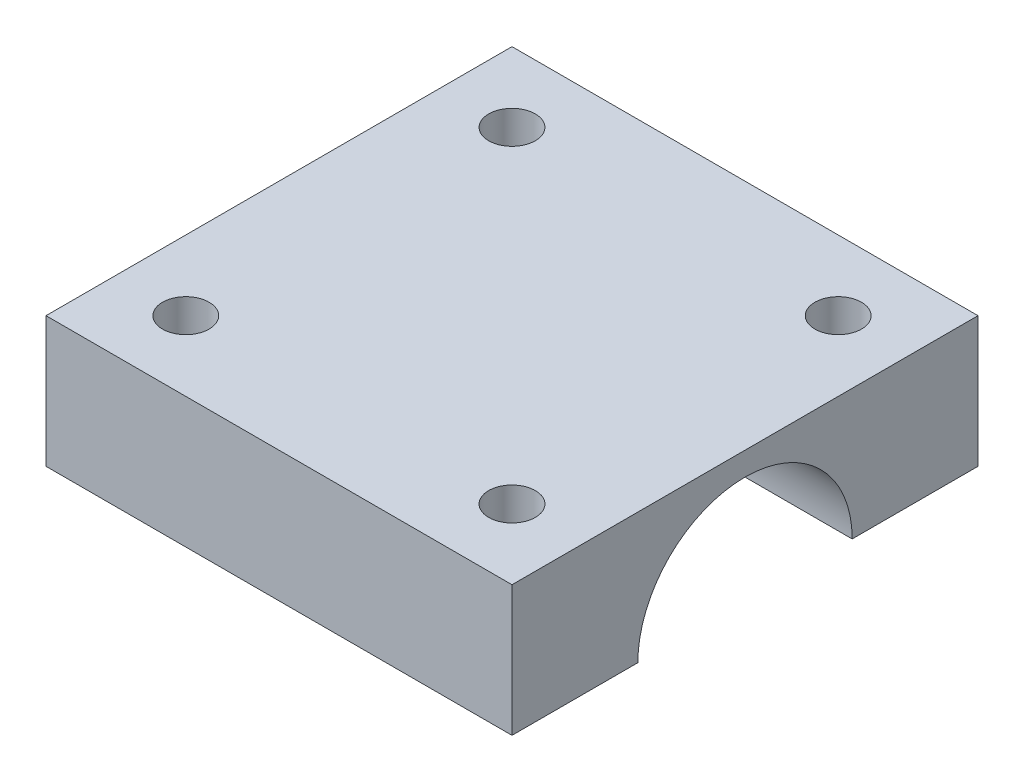
ISO-10303-21;
HEADER;
FILE_DESCRIPTION(('STEP AP214'),'2;1');
FILE_NAME('part.step','',(''),(''),'','','');
FILE_SCHEMA(('AUTOMOTIVE_DESIGN { 1 0 10303 214 1 1 1 1 }'));
ENDSEC;
DATA;
#1=APPLICATION_CONTEXT('core data for automotive mechanical design processes');
#2=APPLICATION_PROTOCOL_DEFINITION('international standard','automotive_design',2000,#1);
#3=PRODUCT_CONTEXT('',#1,'mechanical');
#4=PRODUCT('Part','Part','',(#3));
#5=PRODUCT_RELATED_PRODUCT_CATEGORY('part','',(#4));
#6=PRODUCT_DEFINITION_FORMATION('','',#4);
#7=PRODUCT_DEFINITION_CONTEXT('part definition',#1,'design');
#8=PRODUCT_DEFINITION('design','',#6,#7);
#9=PRODUCT_DEFINITION_SHAPE('','',#8);
#10=(LENGTH_UNIT() NAMED_UNIT(*) SI_UNIT(.MILLI.,.METRE.));
#11=(NAMED_UNIT(*) PLANE_ANGLE_UNIT() SI_UNIT($,.RADIAN.));
#12=(NAMED_UNIT(*) SI_UNIT($,.STERADIAN.) SOLID_ANGLE_UNIT());
#13=UNCERTAINTY_MEASURE_WITH_UNIT(LENGTH_MEASURE(1.E-05),#10,'distance_accuracy_value','');
#14=(GEOMETRIC_REPRESENTATION_CONTEXT(3) GLOBAL_UNCERTAINTY_ASSIGNED_CONTEXT((#13)) GLOBAL_UNIT_ASSIGNED_CONTEXT((#10,
#11,#12)) REPRESENTATION_CONTEXT('',''));
#15=CARTESIAN_POINT('',(0.,0.,0.));
#16=DIRECTION('',(0.,0.,1.));
#17=DIRECTION('',(1.,0.,0.));
#18=AXIS2_PLACEMENT_3D('',#15,#16,#17);
#19=CARTESIAN_POINT('',(0.,0.,0.));
#20=DIRECTION('',(0.,-1.,0.));
#21=DIRECTION('',(0.,0.,-1.));
#22=AXIS2_PLACEMENT_3D('',#19,#20,#21);
#23=PLANE('',#22);
#24=DIRECTION('',(-1.,0.,0.));
#25=VECTOR('',#24,1.);
#26=CARTESIAN_POINT('',(25.,0.,11.5));
#27=LINE('',#26,#25);
#28=CARTESIAN_POINT('',(25.,0.,11.5));
#29=VERTEX_POINT('',#28);
#30=CARTESIAN_POINT('',(-25.,0.,11.5));
#31=VERTEX_POINT('',#30);
#32=EDGE_CURVE('E50',#29,#31,#27,.T.);
#33=ORIENTED_EDGE('',*,*,#32,.F.);
#34=DIRECTION('',(0.,0.,-1.));
#35=VECTOR('',#34,1.);
#36=CARTESIAN_POINT('',(25.,0.,25.));
#37=LINE('',#36,#35);
#38=CARTESIAN_POINT('',(25.,0.,25.));
#39=VERTEX_POINT('',#38);
#40=EDGE_CURVE('E108',#39,#29,#37,.T.);
#41=ORIENTED_EDGE('',*,*,#40,.F.);
#42=DIRECTION('',(1.,0.,0.));
#43=VECTOR('',#42,1.);
#44=CARTESIAN_POINT('',(-25.,0.,25.));
#45=LINE('',#44,#43);
#46=CARTESIAN_POINT('',(-25.,0.,25.));
#47=VERTEX_POINT('',#46);
#48=EDGE_CURVE('E80',#47,#39,#45,.T.);
#49=ORIENTED_EDGE('',*,*,#48,.F.);
#50=DIRECTION('',(0.,0.,1.));
#51=VECTOR('',#50,1.);
#52=CARTESIAN_POINT('',(-25.,0.,25.));
#53=LINE('',#52,#51);
#54=EDGE_CURVE('E109',#31,#47,#53,.T.);
#55=ORIENTED_EDGE('',*,*,#54,.F.);
#56=EDGE_LOOP('',(#33,#41,#49,#55));
#57=FACE_BOUND('',#56,.T.);
#58=CARTESIAN_POINT('',(17.5,0.,17.5));
#59=DIRECTION('',(0.,1.,0.));
#60=DIRECTION('',(0.,0.,1.));
#61=AXIS2_PLACEMENT_3D('',#58,#59,#60);
#62=CIRCLE('',#61,2.5);
#63=CARTESIAN_POINT('',(17.5,0.,20.));
#64=VERTEX_POINT('',#63);
#65=EDGE_CURVE('E110',#64,#64,#62,.T.);
#66=ORIENTED_EDGE('',*,*,#65,.T.);
#67=EDGE_LOOP('',(#66));
#68=FACE_BOUND('',#67,.T.);
#69=CARTESIAN_POINT('',(-17.5,0.,17.5));
#70=DIRECTION('',(0.,1.,0.));
#71=DIRECTION('',(0.,0.,1.));
#72=AXIS2_PLACEMENT_3D('',#69,#70,#71);
#73=CIRCLE('',#72,2.5);
#74=CARTESIAN_POINT('',(-17.5,0.,20.));
#75=VERTEX_POINT('',#74);
#76=EDGE_CURVE('E152',#75,#75,#73,.T.);
#77=ORIENTED_EDGE('',*,*,#76,.T.);
#78=EDGE_LOOP('',(#77));
#79=FACE_BOUND('',#78,.T.);
#80=ADVANCED_FACE('F35',(#57,#68,#79),#23,.T.);
#81=CARTESIAN_POINT('',(0.,14.,0.));
#82=DIRECTION('',(0.,-1.,0.));
#83=DIRECTION('',(0.,0.,-1.));
#84=AXIS2_PLACEMENT_3D('',#81,#82,#83);
#85=PLANE('',#84);
#86=DIRECTION('',(0.,0.,-1.));
#87=VECTOR('',#86,1.);
#88=CARTESIAN_POINT('',(25.,14.,25.));
#89=LINE('',#88,#87);
#90=CARTESIAN_POINT('',(25.,14.,25.));
#91=VERTEX_POINT('',#90);
#92=CARTESIAN_POINT('',(25.,14.,-25.));
#93=VERTEX_POINT('',#92);
#94=EDGE_CURVE('E126',#91,#93,#89,.T.);
#95=ORIENTED_EDGE('',*,*,#94,.T.);
#96=DIRECTION('',(-1.,0.,0.));
#97=VECTOR('',#96,1.);
#98=CARTESIAN_POINT('',(-25.,14.,-25.));
#99=LINE('',#98,#97);
#100=CARTESIAN_POINT('',(-25.,14.,-25.));
#101=VERTEX_POINT('',#100);
#102=EDGE_CURVE('E87',#93,#101,#99,.T.);
#103=ORIENTED_EDGE('',*,*,#102,.T.);
#104=DIRECTION('',(0.,0.,1.));
#105=VECTOR('',#104,1.);
#106=CARTESIAN_POINT('',(-25.,14.,25.));
#107=LINE('',#106,#105);
#108=CARTESIAN_POINT('',(-25.,14.,25.));
#109=VERTEX_POINT('',#108);
#110=EDGE_CURVE('E135',#101,#109,#107,.T.);
#111=ORIENTED_EDGE('',*,*,#110,.T.);
#112=DIRECTION('',(1.,0.,0.));
#113=VECTOR('',#112,1.);
#114=CARTESIAN_POINT('',(-25.,14.,25.));
#115=LINE('',#114,#113);
#116=EDGE_CURVE('E59',#109,#91,#115,.T.);
#117=ORIENTED_EDGE('',*,*,#116,.T.);
#118=EDGE_LOOP('',(#95,#103,#111,#117));
#119=FACE_BOUND('',#118,.T.);
#120=CARTESIAN_POINT('',(-17.5,14.,-17.5));
#121=DIRECTION('',(0.,1.,0.));
#122=DIRECTION('',(0.,0.,1.));
#123=AXIS2_PLACEMENT_3D('',#120,#121,#122);
#124=CIRCLE('',#123,2.5);
#125=CARTESIAN_POINT('',(-17.5,14.,-15.));
#126=VERTEX_POINT('',#125);
#127=EDGE_CURVE('E118',#126,#126,#124,.T.);
#128=ORIENTED_EDGE('',*,*,#127,.F.);
#129=EDGE_LOOP('',(#128));
#130=FACE_BOUND('',#129,.T.);
#131=CARTESIAN_POINT('',(-17.5,14.,17.5));
#132=DIRECTION('',(0.,1.,0.));
#133=DIRECTION('',(0.,0.,1.));
#134=AXIS2_PLACEMENT_3D('',#131,#132,#133);
#135=CIRCLE('',#134,2.5);
#136=CARTESIAN_POINT('',(-17.5,14.,20.));
#137=VERTEX_POINT('',#136);
#138=EDGE_CURVE('E155',#137,#137,#135,.T.);
#139=ORIENTED_EDGE('',*,*,#138,.F.);
#140=EDGE_LOOP('',(#139));
#141=FACE_BOUND('',#140,.T.);
#142=CARTESIAN_POINT('',(17.5,14.,-17.5));
#143=DIRECTION('',(0.,1.,0.));
#144=DIRECTION('',(0.,0.,1.));
#145=AXIS2_PLACEMENT_3D('',#142,#143,#144);
#146=CIRCLE('',#145,2.5);
#147=CARTESIAN_POINT('',(17.5,14.,-15.));
#148=VERTEX_POINT('',#147);
#149=EDGE_CURVE('E149',#148,#148,#146,.T.);
#150=ORIENTED_EDGE('',*,*,#149,.F.);
#151=EDGE_LOOP('',(#150));
#152=FACE_BOUND('',#151,.T.);
#153=CARTESIAN_POINT('',(17.5,14.,17.5));
#154=DIRECTION('',(0.,1.,0.));
#155=DIRECTION('',(0.,0.,1.));
#156=AXIS2_PLACEMENT_3D('',#153,#154,#155);
#157=CIRCLE('',#156,2.5);
#158=CARTESIAN_POINT('',(17.5,14.,20.));
#159=VERTEX_POINT('',#158);
#160=EDGE_CURVE('E143',#159,#159,#157,.T.);
#161=ORIENTED_EDGE('',*,*,#160,.F.);
#162=EDGE_LOOP('',(#161));
#163=FACE_BOUND('',#162,.T.);
#164=ADVANCED_FACE('F166',(#119,#130,#141,#152,#163),#85,.F.);
#165=DIRECTION('',(-1.,0.,0.));
#166=VECTOR('',#165,1.);
#167=CARTESIAN_POINT('',(25.,0.,-11.5));
#168=LINE('',#167,#166);
#169=CARTESIAN_POINT('',(-25.,0.,-11.5));
#170=VERTEX_POINT('',#169);
#171=CARTESIAN_POINT('',(25.,0.,-11.5));
#172=VERTEX_POINT('',#171);
#173=EDGE_CURVE('E98',#170,#172,#168,.F.);
#174=ORIENTED_EDGE('',*,*,#173,.F.);
#175=CARTESIAN_POINT('',(-25.,0.,-25.));
#176=VERTEX_POINT('',#175);
#177=EDGE_CURVE('E122',#176,#170,#53,.T.);
#178=ORIENTED_EDGE('',*,*,#177,.F.);
#179=DIRECTION('',(-1.,0.,0.));
#180=VECTOR('',#179,1.);
#181=CARTESIAN_POINT('',(-25.,0.,-25.));
#182=LINE('',#181,#180);
#183=CARTESIAN_POINT('',(25.,0.,-25.));
#184=VERTEX_POINT('',#183);
#185=EDGE_CURVE('E114',#184,#176,#182,.T.);
#186=ORIENTED_EDGE('',*,*,#185,.F.);
#187=EDGE_CURVE('E115',#172,#184,#37,.T.);
#188=ORIENTED_EDGE('',*,*,#187,.F.);
#189=EDGE_LOOP('',(#174,#178,#186,#188));
#190=FACE_BOUND('',#189,.T.);
#191=CARTESIAN_POINT('',(17.5,0.,-17.5));
#192=DIRECTION('',(0.,1.,0.));
#193=DIRECTION('',(0.,0.,1.));
#194=AXIS2_PLACEMENT_3D('',#191,#192,#193);
#195=CIRCLE('',#194,2.5);
#196=CARTESIAN_POINT('',(17.5,0.,-15.));
#197=VERTEX_POINT('',#196);
#198=EDGE_CURVE('E146',#197,#197,#195,.T.);
#199=ORIENTED_EDGE('',*,*,#198,.T.);
#200=EDGE_LOOP('',(#199));
#201=FACE_BOUND('',#200,.T.);
#202=CARTESIAN_POINT('',(-17.5,0.,-17.5));
#203=DIRECTION('',(0.,1.,0.));
#204=DIRECTION('',(0.,0.,1.));
#205=AXIS2_PLACEMENT_3D('',#202,#203,#204);
#206=CIRCLE('',#205,2.5);
#207=CARTESIAN_POINT('',(-17.5,0.,-15.));
#208=VERTEX_POINT('',#207);
#209=EDGE_CURVE('E158',#208,#208,#206,.T.);
#210=ORIENTED_EDGE('',*,*,#209,.T.);
#211=EDGE_LOOP('',(#210));
#212=FACE_BOUND('',#211,.T.);
#213=ADVANCED_FACE('F138',(#190,#201,#212),#23,.T.);
#214=CARTESIAN_POINT('',(25.,14.,25.));
#215=DIRECTION('',(-1.,0.,0.));
#216=DIRECTION('',(0.,0.,1.));
#217=AXIS2_PLACEMENT_3D('',#214,#215,#216);
#218=PLANE('',#217);
#219=ORIENTED_EDGE('',*,*,#40,.T.);
#220=CARTESIAN_POINT('',(25.,0.,0.));
#221=DIRECTION('',(-1.,0.,0.));
#222=DIRECTION('',(0.,0.,1.));
#223=AXIS2_PLACEMENT_3D('',#220,#221,#222);
#224=CIRCLE('',#223,11.5);
#225=EDGE_CURVE('E95',#29,#172,#224,.T.);
#226=ORIENTED_EDGE('',*,*,#225,.T.);
#227=ORIENTED_EDGE('',*,*,#187,.T.);
#228=DIRECTION('',(0.,-1.,0.));
#229=VECTOR('',#228,1.);
#230=CARTESIAN_POINT('',(25.,14.,-25.));
#231=LINE('',#230,#229);
#232=EDGE_CURVE('E11',#93,#184,#231,.T.);
#233=ORIENTED_EDGE('',*,*,#232,.F.);
#234=ORIENTED_EDGE('',*,*,#94,.F.);
#235=DIRECTION('',(0.,-1.,0.));
#236=VECTOR('',#235,1.);
#237=CARTESIAN_POINT('',(25.,14.,25.));
#238=LINE('',#237,#236);
#239=EDGE_CURVE('E113',#91,#39,#238,.T.);
#240=ORIENTED_EDGE('',*,*,#239,.T.);
#241=EDGE_LOOP('',(#219,#226,#227,#233,#234,#240));
#242=FACE_BOUND('',#241,.T.);
#243=ADVANCED_FACE('F37',(#242),#218,.F.);
#244=CARTESIAN_POINT('',(-25.,14.,-25.));
#245=DIRECTION('',(0.,0.,1.));
#246=DIRECTION('',(1.,0.,0.));
#247=AXIS2_PLACEMENT_3D('',#244,#245,#246);
#248=PLANE('',#247);
#249=ORIENTED_EDGE('',*,*,#185,.T.);
#250=DIRECTION('',(0.,-1.,0.));
#251=VECTOR('',#250,1.);
#252=CARTESIAN_POINT('',(-25.,14.,-25.));
#253=LINE('',#252,#251);
#254=EDGE_CURVE('E43',#101,#176,#253,.T.);
#255=ORIENTED_EDGE('',*,*,#254,.F.);
#256=ORIENTED_EDGE('',*,*,#102,.F.);
#257=ORIENTED_EDGE('',*,*,#232,.T.);
#258=EDGE_LOOP('',(#249,#255,#256,#257));
#259=FACE_BOUND('',#258,.T.);
#260=ADVANCED_FACE('F170',(#259),#248,.F.);
#261=CARTESIAN_POINT('',(-25.,14.,25.));
#262=DIRECTION('',(1.,0.,0.));
#263=DIRECTION('',(0.,0.,-1.));
#264=AXIS2_PLACEMENT_3D('',#261,#262,#263);
#265=PLANE('',#264);
#266=ORIENTED_EDGE('',*,*,#177,.T.);
#267=CARTESIAN_POINT('',(-25.,0.,0.));
#268=DIRECTION('',(-1.,0.,0.));
#269=DIRECTION('',(0.,0.,1.));
#270=AXIS2_PLACEMENT_3D('',#267,#268,#269);
#271=CIRCLE('',#270,11.5);
#272=EDGE_CURVE('E102',#31,#170,#271,.T.);
#273=ORIENTED_EDGE('',*,*,#272,.F.);
#274=ORIENTED_EDGE('',*,*,#54,.T.);
#275=DIRECTION('',(0.,-1.,0.));
#276=VECTOR('',#275,1.);
#277=CARTESIAN_POINT('',(-25.,14.,25.));
#278=LINE('',#277,#276);
#279=EDGE_CURVE('E128',#109,#47,#278,.T.);
#280=ORIENTED_EDGE('',*,*,#279,.F.);
#281=ORIENTED_EDGE('',*,*,#110,.F.);
#282=ORIENTED_EDGE('',*,*,#254,.T.);
#283=EDGE_LOOP('',(#266,#273,#274,#280,#281,#282));
#284=FACE_BOUND('',#283,.T.);
#285=ADVANCED_FACE('F133',(#284),#265,.F.);
#286=CARTESIAN_POINT('',(-25.,14.,25.));
#287=DIRECTION('',(0.,0.,-1.));
#288=DIRECTION('',(-1.,0.,0.));
#289=AXIS2_PLACEMENT_3D('',#286,#287,#288);
#290=PLANE('',#289);
#291=ORIENTED_EDGE('',*,*,#48,.T.);
#292=ORIENTED_EDGE('',*,*,#239,.F.);
#293=ORIENTED_EDGE('',*,*,#116,.F.);
#294=ORIENTED_EDGE('',*,*,#279,.T.);
#295=EDGE_LOOP('',(#291,#292,#293,#294));
#296=FACE_BOUND('',#295,.T.);
#297=ADVANCED_FACE('F168',(#296),#290,.F.);
#298=CARTESIAN_POINT('',(-17.5,14.,-17.5));
#299=DIRECTION('',(0.,-1.,0.));
#300=DIRECTION('',(0.,0.,-1.));
#301=AXIS2_PLACEMENT_3D('',#298,#299,#300);
#302=CYLINDRICAL_SURFACE('',#301,2.5);
#303=ORIENTED_EDGE('',*,*,#127,.T.);
#304=EDGE_LOOP('',(#303));
#305=FACE_BOUND('',#304,.T.);
#306=ORIENTED_EDGE('',*,*,#209,.F.);
#307=EDGE_LOOP('',(#306));
#308=FACE_BOUND('',#307,.T.);
#309=ADVANCED_FACE('F236',(#305,#308),#302,.F.);
#310=CARTESIAN_POINT('',(-17.5,14.,17.5));
#311=DIRECTION('',(0.,-1.,0.));
#312=DIRECTION('',(0.,0.,-1.));
#313=AXIS2_PLACEMENT_3D('',#310,#311,#312);
#314=CYLINDRICAL_SURFACE('',#313,2.5);
#315=ORIENTED_EDGE('',*,*,#138,.T.);
#316=EDGE_LOOP('',(#315));
#317=FACE_BOUND('',#316,.T.);
#318=ORIENTED_EDGE('',*,*,#76,.F.);
#319=EDGE_LOOP('',(#318));
#320=FACE_BOUND('',#319,.T.);
#321=ADVANCED_FACE('F228',(#317,#320),#314,.F.);
#322=CARTESIAN_POINT('',(17.5,14.,-17.5));
#323=DIRECTION('',(0.,-1.,0.));
#324=DIRECTION('',(0.,0.,-1.));
#325=AXIS2_PLACEMENT_3D('',#322,#323,#324);
#326=CYLINDRICAL_SURFACE('',#325,2.5);
#327=ORIENTED_EDGE('',*,*,#149,.T.);
#328=EDGE_LOOP('',(#327));
#329=FACE_BOUND('',#328,.T.);
#330=ORIENTED_EDGE('',*,*,#198,.F.);
#331=EDGE_LOOP('',(#330));
#332=FACE_BOUND('',#331,.T.);
#333=ADVANCED_FACE('F220',(#329,#332),#326,.F.);
#334=CARTESIAN_POINT('',(17.5,14.,17.5));
#335=DIRECTION('',(0.,-1.,0.));
#336=DIRECTION('',(0.,0.,-1.));
#337=AXIS2_PLACEMENT_3D('',#334,#335,#336);
#338=CYLINDRICAL_SURFACE('',#337,2.5);
#339=ORIENTED_EDGE('',*,*,#160,.T.);
#340=EDGE_LOOP('',(#339));
#341=FACE_BOUND('',#340,.T.);
#342=ORIENTED_EDGE('',*,*,#65,.F.);
#343=EDGE_LOOP('',(#342));
#344=FACE_BOUND('',#343,.T.);
#345=ADVANCED_FACE('F210',(#341,#344),#338,.F.);
#346=CARTESIAN_POINT('',(25.,0.,0.));
#347=DIRECTION('',(-1.,0.,0.));
#348=DIRECTION('',(0.,0.,1.));
#349=AXIS2_PLACEMENT_3D('',#346,#347,#348);
#350=CYLINDRICAL_SURFACE('',#349,11.5);
#351=ORIENTED_EDGE('',*,*,#32,.T.);
#352=ORIENTED_EDGE('',*,*,#272,.T.);
#353=ORIENTED_EDGE('',*,*,#173,.T.);
#354=ORIENTED_EDGE('',*,*,#225,.F.);
#355=EDGE_LOOP('',(#351,#352,#353,#354));
#356=FACE_BOUND('',#355,.T.);
#357=ADVANCED_FACE('F96',(#356),#350,.F.);
#358=CLOSED_SHELL('',(#80,#164,#213,#243,#260,#285,#297,#309,#321,#333,#345,#357));
#359=MANIFOLD_SOLID_BREP('B2',#358);
#360=ADVANCED_BREP_SHAPE_REPRESENTATION('',(#18,#359),#14);
#361=SHAPE_DEFINITION_REPRESENTATION(#9,#360);
ENDSEC;
END-ISO-10303-21;
